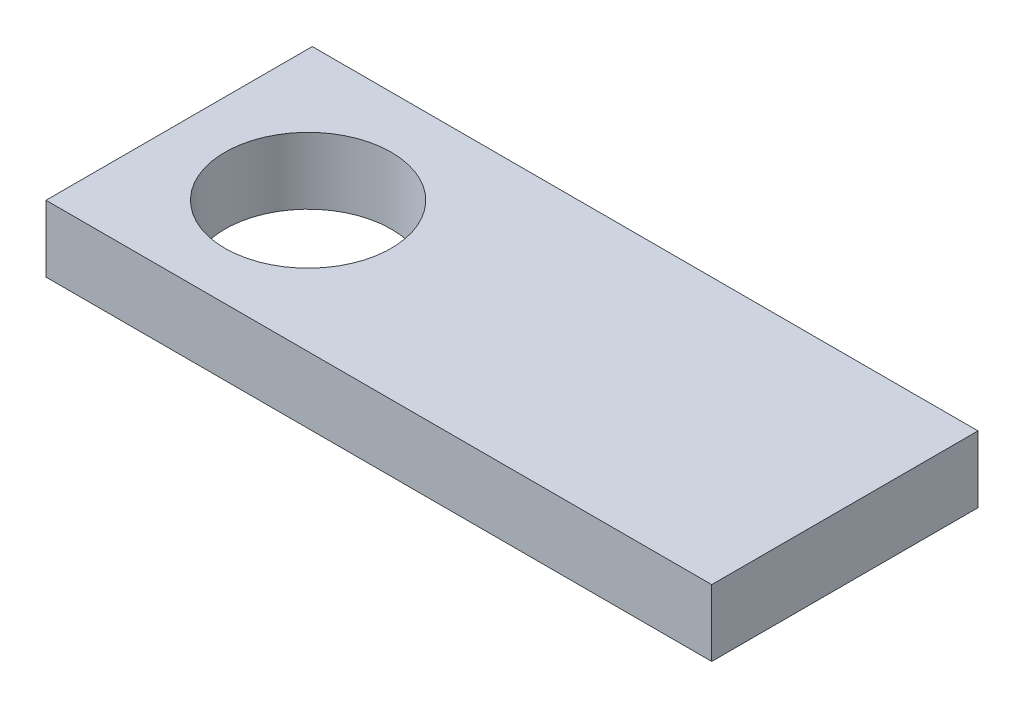
ISO-10303-21;
HEADER;
FILE_DESCRIPTION(('STEP AP214'),'2;1');
FILE_NAME('part.step','',(''),(''),'','','');
FILE_SCHEMA(('AUTOMOTIVE_DESIGN { 1 0 10303 214 1 1 1 1 }'));
ENDSEC;
DATA;
#1=APPLICATION_CONTEXT('core data for automotive mechanical design processes');
#2=APPLICATION_PROTOCOL_DEFINITION('international standard','automotive_design',2000,#1);
#3=PRODUCT_CONTEXT('',#1,'mechanical');
#4=PRODUCT('Part','Part','',(#3));
#5=PRODUCT_RELATED_PRODUCT_CATEGORY('part','',(#4));
#6=PRODUCT_DEFINITION_FORMATION('','',#4);
#7=PRODUCT_DEFINITION_CONTEXT('part definition',#1,'design');
#8=PRODUCT_DEFINITION('design','',#6,#7);
#9=PRODUCT_DEFINITION_SHAPE('','',#8);
#10=(LENGTH_UNIT() NAMED_UNIT(*) SI_UNIT(.MILLI.,.METRE.));
#11=(NAMED_UNIT(*) PLANE_ANGLE_UNIT() SI_UNIT($,.RADIAN.));
#12=(NAMED_UNIT(*) SI_UNIT($,.STERADIAN.) SOLID_ANGLE_UNIT());
#13=UNCERTAINTY_MEASURE_WITH_UNIT(LENGTH_MEASURE(1.E-05),#10,'distance_accuracy_value','');
#14=(GEOMETRIC_REPRESENTATION_CONTEXT(3) GLOBAL_UNCERTAINTY_ASSIGNED_CONTEXT((#13)) GLOBAL_UNIT_ASSIGNED_CONTEXT((#10,
#11,#12)) REPRESENTATION_CONTEXT('',''));
#15=CARTESIAN_POINT('',(0.,0.,0.));
#16=DIRECTION('',(0.,0.,1.));
#17=DIRECTION('',(1.,0.,0.));
#18=AXIS2_PLACEMENT_3D('',#15,#16,#17);
#19=CARTESIAN_POINT('',(0.,12.7,0.));
#20=DIRECTION('',(1.,0.,0.));
#21=DIRECTION('',(0.,0.,-1.));
#22=AXIS2_PLACEMENT_3D('',#19,#20,#21);
#23=PLANE('',#22);
#24=DIRECTION('',(0.,0.,1.));
#25=VECTOR('',#24,1.);
#26=CARTESIAN_POINT('',(0.,0.,0.));
#27=LINE('',#26,#25);
#28=CARTESIAN_POINT('',(0.,0.,-50.8));
#29=VERTEX_POINT('',#28);
#30=CARTESIAN_POINT('',(0.,0.,0.));
#31=VERTEX_POINT('',#30);
#32=EDGE_CURVE('E94',#29,#31,#27,.T.);
#33=ORIENTED_EDGE('',*,*,#32,.T.);
#34=DIRECTION('',(0.,-1.,0.));
#35=VECTOR('',#34,1.);
#36=CARTESIAN_POINT('',(0.,12.7,0.));
#37=LINE('',#36,#35);
#38=CARTESIAN_POINT('',(0.,12.7,0.));
#39=VERTEX_POINT('',#38);
#40=EDGE_CURVE('E11',#39,#31,#37,.T.);
#41=ORIENTED_EDGE('',*,*,#40,.F.);
#42=DIRECTION('',(0.,0.,1.));
#43=VECTOR('',#42,1.);
#44=CARTESIAN_POINT('',(0.,12.7,0.));
#45=LINE('',#44,#43);
#46=CARTESIAN_POINT('',(0.,12.7,-50.8));
#47=VERTEX_POINT('',#46);
#48=EDGE_CURVE('E82',#47,#39,#45,.T.);
#49=ORIENTED_EDGE('',*,*,#48,.F.);
#50=DIRECTION('',(0.,-1.,0.));
#51=VECTOR('',#50,1.);
#52=CARTESIAN_POINT('',(0.,12.7,-50.8));
#53=LINE('',#52,#51);
#54=EDGE_CURVE('E90',#47,#29,#53,.T.);
#55=ORIENTED_EDGE('',*,*,#54,.T.);
#56=EDGE_LOOP('',(#33,#41,#49,#55));
#57=FACE_BOUND('',#56,.T.);
#58=ADVANCED_FACE('F31',(#57),#23,.F.);
#59=CARTESIAN_POINT('',(0.,12.7,0.));
#60=DIRECTION('',(0.,0.,-1.));
#61=DIRECTION('',(-1.,0.,0.));
#62=AXIS2_PLACEMENT_3D('',#59,#60,#61);
#63=PLANE('',#62);
#64=DIRECTION('',(1.,0.,0.));
#65=VECTOR('',#64,1.);
#66=CARTESIAN_POINT('',(0.,0.,0.));
#67=LINE('',#66,#65);
#68=CARTESIAN_POINT('',(127.,0.,0.));
#69=VERTEX_POINT('',#68);
#70=EDGE_CURVE('E86',#31,#69,#67,.T.);
#71=ORIENTED_EDGE('',*,*,#70,.T.);
#72=DIRECTION('',(0.,-1.,0.));
#73=VECTOR('',#72,1.);
#74=CARTESIAN_POINT('',(127.,12.7,0.));
#75=LINE('',#74,#73);
#76=CARTESIAN_POINT('',(127.,12.7,0.));
#77=VERTEX_POINT('',#76);
#78=EDGE_CURVE('E39',#77,#69,#75,.T.);
#79=ORIENTED_EDGE('',*,*,#78,.F.);
#80=DIRECTION('',(1.,0.,0.));
#81=VECTOR('',#80,1.);
#82=CARTESIAN_POINT('',(0.,12.7,0.));
#83=LINE('',#82,#81);
#84=EDGE_CURVE('E77',#39,#77,#83,.T.);
#85=ORIENTED_EDGE('',*,*,#84,.F.);
#86=ORIENTED_EDGE('',*,*,#40,.T.);
#87=EDGE_LOOP('',(#71,#79,#85,#86));
#88=FACE_BOUND('',#87,.T.);
#89=ADVANCED_FACE('F85',(#88),#63,.F.);
#90=CARTESIAN_POINT('',(127.,12.7,0.));
#91=DIRECTION('',(-1.,0.,0.));
#92=DIRECTION('',(0.,0.,1.));
#93=AXIS2_PLACEMENT_3D('',#90,#91,#92);
#94=PLANE('',#93);
#95=DIRECTION('',(0.,0.,-1.));
#96=VECTOR('',#95,1.);
#97=CARTESIAN_POINT('',(127.,0.,0.));
#98=LINE('',#97,#96);
#99=CARTESIAN_POINT('',(127.,0.,-50.8));
#100=VERTEX_POINT('',#99);
#101=EDGE_CURVE('E64',#69,#100,#98,.T.);
#102=ORIENTED_EDGE('',*,*,#101,.T.);
#103=DIRECTION('',(0.,-1.,0.));
#104=VECTOR('',#103,1.);
#105=CARTESIAN_POINT('',(127.,12.7,-50.8));
#106=LINE('',#105,#104);
#107=CARTESIAN_POINT('',(127.,12.7,-50.8));
#108=VERTEX_POINT('',#107);
#109=EDGE_CURVE('E87',#108,#100,#106,.T.);
#110=ORIENTED_EDGE('',*,*,#109,.F.);
#111=DIRECTION('',(0.,0.,-1.));
#112=VECTOR('',#111,1.);
#113=CARTESIAN_POINT('',(127.,12.7,0.));
#114=LINE('',#113,#112);
#115=EDGE_CURVE('E80',#77,#108,#114,.T.);
#116=ORIENTED_EDGE('',*,*,#115,.F.);
#117=ORIENTED_EDGE('',*,*,#78,.T.);
#118=EDGE_LOOP('',(#102,#110,#116,#117));
#119=FACE_BOUND('',#118,.T.);
#120=ADVANCED_FACE('F88',(#119),#94,.F.);
#121=CARTESIAN_POINT('',(0.,12.7,-50.8));
#122=DIRECTION('',(0.,0.,1.));
#123=DIRECTION('',(1.,0.,0.));
#124=AXIS2_PLACEMENT_3D('',#121,#122,#123);
#125=PLANE('',#124);
#126=DIRECTION('',(-1.,0.,0.));
#127=VECTOR('',#126,1.);
#128=CARTESIAN_POINT('',(0.,0.,-50.8));
#129=LINE('',#128,#127);
#130=EDGE_CURVE('E70',#100,#29,#129,.T.);
#131=ORIENTED_EDGE('',*,*,#130,.T.);
#132=ORIENTED_EDGE('',*,*,#54,.F.);
#133=DIRECTION('',(-1.,0.,0.));
#134=VECTOR('',#133,1.);
#135=CARTESIAN_POINT('',(0.,12.7,-50.8));
#136=LINE('',#135,#134);
#137=EDGE_CURVE('E47',#108,#47,#136,.T.);
#138=ORIENTED_EDGE('',*,*,#137,.F.);
#139=ORIENTED_EDGE('',*,*,#109,.T.);
#140=EDGE_LOOP('',(#131,#132,#138,#139));
#141=FACE_BOUND('',#140,.T.);
#142=ADVANCED_FACE('F102',(#141),#125,.F.);
#143=CARTESIAN_POINT('',(0.,12.7,-50.8));
#144=DIRECTION('',(0.,-1.,0.));
#145=DIRECTION('',(0.,0.,-1.));
#146=AXIS2_PLACEMENT_3D('',#143,#144,#145);
#147=PLANE('',#146);
#148=CARTESIAN_POINT('',(25.,12.7,-25.));
#149=DIRECTION('',(0.,1.,0.));
#150=DIRECTION('',(0.,0.,1.));
#151=AXIS2_PLACEMENT_3D('',#148,#149,#150);
#152=CIRCLE('',#151,15.875);
#153=CARTESIAN_POINT('',(25.,12.7,-9.12500000000001));
#154=VERTEX_POINT('',#153);
#155=EDGE_CURVE('E108',#154,#154,#152,.T.);
#156=ORIENTED_EDGE('',*,*,#155,.F.);
#157=EDGE_LOOP('',(#156));
#158=FACE_BOUND('',#157,.T.);
#159=ORIENTED_EDGE('',*,*,#48,.T.);
#160=ORIENTED_EDGE('',*,*,#84,.T.);
#161=ORIENTED_EDGE('',*,*,#115,.T.);
#162=ORIENTED_EDGE('',*,*,#137,.T.);
#163=EDGE_LOOP('',(#159,#160,#161,#162));
#164=FACE_BOUND('',#163,.T.);
#165=ADVANCED_FACE('F78',(#158,#164),#147,.F.);
#166=CARTESIAN_POINT('',(0.,0.,-50.8));
#167=DIRECTION('',(0.,-1.,0.));
#168=DIRECTION('',(0.,0.,-1.));
#169=AXIS2_PLACEMENT_3D('',#166,#167,#168);
#170=PLANE('',#169);
#171=CARTESIAN_POINT('',(25.,0.,-25.));
#172=DIRECTION('',(0.,1.,0.));
#173=DIRECTION('',(0.,0.,1.));
#174=AXIS2_PLACEMENT_3D('',#171,#172,#173);
#175=CIRCLE('',#174,15.875);
#176=CARTESIAN_POINT('',(25.,0.,-9.12500000000001));
#177=VERTEX_POINT('',#176);
#178=EDGE_CURVE('E97',#177,#177,#175,.T.);
#179=ORIENTED_EDGE('',*,*,#178,.T.);
#180=EDGE_LOOP('',(#179));
#181=FACE_BOUND('',#180,.T.);
#182=ORIENTED_EDGE('',*,*,#32,.F.);
#183=ORIENTED_EDGE('',*,*,#130,.F.);
#184=ORIENTED_EDGE('',*,*,#101,.F.);
#185=ORIENTED_EDGE('',*,*,#70,.F.);
#186=EDGE_LOOP('',(#182,#183,#184,#185));
#187=FACE_BOUND('',#186,.T.);
#188=ADVANCED_FACE('F105',(#181,#187),#170,.T.);
#189=CARTESIAN_POINT('',(25.,0.,-25.));
#190=DIRECTION('',(0.,1.,0.));
#191=DIRECTION('',(0.,0.,1.));
#192=AXIS2_PLACEMENT_3D('',#189,#190,#191);
#193=CYLINDRICAL_SURFACE('',#192,15.875);
#194=ORIENTED_EDGE('',*,*,#178,.F.);
#195=EDGE_LOOP('',(#194));
#196=FACE_BOUND('',#195,.T.);
#197=ORIENTED_EDGE('',*,*,#155,.T.);
#198=EDGE_LOOP('',(#197));
#199=FACE_BOUND('',#198,.T.);
#200=ADVANCED_FACE('F115',(#196,#199),#193,.F.);
#201=CLOSED_SHELL('',(#58,#89,#120,#142,#165,#188,#200));
#202=MANIFOLD_SOLID_BREP('B2',#201);
#203=ADVANCED_BREP_SHAPE_REPRESENTATION('',(#18,#202),#14);
#204=SHAPE_DEFINITION_REPRESENTATION(#9,#203);
ENDSEC;
END-ISO-10303-21;
